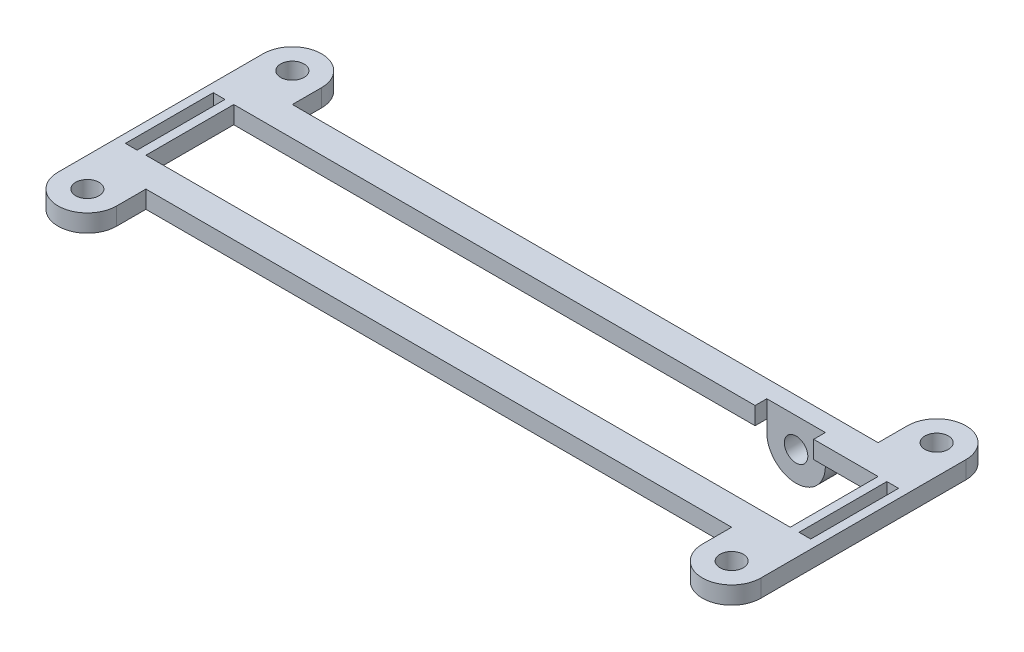
ISO-10303-21;
HEADER;
FILE_DESCRIPTION(('STEP AP214'),'2;1');
FILE_NAME('part.step','',(''),(''),'','','');
FILE_SCHEMA(('AUTOMOTIVE_DESIGN { 1 0 10303 214 1 1 1 1 }'));
ENDSEC;
DATA;
#1=APPLICATION_CONTEXT('core data for automotive mechanical design processes');
#2=APPLICATION_PROTOCOL_DEFINITION('international standard','automotive_design',2000,#1);
#3=PRODUCT_CONTEXT('',#1,'mechanical');
#4=PRODUCT('Part','Part','',(#3));
#5=PRODUCT_RELATED_PRODUCT_CATEGORY('part','',(#4));
#6=PRODUCT_DEFINITION_FORMATION('','',#4);
#7=PRODUCT_DEFINITION_CONTEXT('part definition',#1,'design');
#8=PRODUCT_DEFINITION('design','',#6,#7);
#9=PRODUCT_DEFINITION_SHAPE('','',#8);
#10=(LENGTH_UNIT() NAMED_UNIT(*) SI_UNIT(.MILLI.,.METRE.));
#11=(NAMED_UNIT(*) PLANE_ANGLE_UNIT() SI_UNIT($,.RADIAN.));
#12=(NAMED_UNIT(*) SI_UNIT($,.STERADIAN.) SOLID_ANGLE_UNIT());
#13=UNCERTAINTY_MEASURE_WITH_UNIT(LENGTH_MEASURE(1.E-05),#10,'distance_accuracy_value','');
#14=(GEOMETRIC_REPRESENTATION_CONTEXT(3) GLOBAL_UNCERTAINTY_ASSIGNED_CONTEXT((#13)) GLOBAL_UNIT_ASSIGNED_CONTEXT((#10,
#11,#12)) REPRESENTATION_CONTEXT('',''));
#15=CARTESIAN_POINT('',(0.,0.,0.));
#16=DIRECTION('',(0.,0.,1.));
#17=DIRECTION('',(1.,0.,0.));
#18=AXIS2_PLACEMENT_3D('',#15,#16,#17);
#19=CARTESIAN_POINT('',(0.,3.,-20.));
#20=DIRECTION('',(0.,0.,-1.));
#21=DIRECTION('',(-1.,0.,0.));
#22=AXIS2_PLACEMENT_3D('',#19,#20,#21);
#23=PLANE('',#22);
#24=DIRECTION('',(1.,0.,0.));
#25=VECTOR('',#24,1.);
#26=CARTESIAN_POINT('',(0.,3.,-20.));
#27=LINE('',#26,#25);
#28=CARTESIAN_POINT('',(104.,3.,-20.));
#29=VERTEX_POINT('',#28);
#30=CARTESIAN_POINT('',(115.,3.,-20.));
#31=VERTEX_POINT('',#30);
#32=EDGE_CURVE('E396',#29,#31,#27,.T.);
#33=ORIENTED_EDGE('',*,*,#32,.F.);
#34=DIRECTION('',(0.,1.,0.));
#35=VECTOR('',#34,1.);
#36=CARTESIAN_POINT('',(104.,0.,-20.));
#37=LINE('',#36,#35);
#38=CARTESIAN_POINT('',(104.,0.,-20.));
#39=VERTEX_POINT('',#38);
#40=EDGE_CURVE('E246',#39,#29,#37,.T.);
#41=ORIENTED_EDGE('',*,*,#40,.F.);
#42=DIRECTION('',(1.,0.,0.));
#43=VECTOR('',#42,1.);
#44=CARTESIAN_POINT('',(0.,0.,-20.));
#45=LINE('',#44,#43);
#46=CARTESIAN_POINT('',(115.,0.,-20.));
#47=VERTEX_POINT('',#46);
#48=EDGE_CURVE('E452',#39,#47,#45,.T.);
#49=ORIENTED_EDGE('',*,*,#48,.T.);
#50=DIRECTION('',(0.,-1.,0.));
#51=VECTOR('',#50,1.);
#52=CARTESIAN_POINT('',(115.,3.,-20.));
#53=LINE('',#52,#51);
#54=EDGE_CURVE('E11',#31,#47,#53,.T.);
#55=ORIENTED_EDGE('',*,*,#54,.F.);
#56=EDGE_LOOP('',(#33,#41,#49,#55));
#57=FACE_BOUND('',#56,.T.);
#58=ADVANCED_FACE('F34',(#57),#23,.F.);
#59=CARTESIAN_POINT('',(0.,0.,0.));
#60=DIRECTION('',(0.,1.,0.));
#61=DIRECTION('',(0.,0.,1.));
#62=AXIS2_PLACEMENT_3D('',#59,#60,#61);
#63=PLANE('',#62);
#64=CARTESIAN_POINT('',(115.,0.,5.));
#65=DIRECTION('',(0.,1.,0.));
#66=DIRECTION('',(0.,0.,1.));
#67=AXIS2_PLACEMENT_3D('',#64,#65,#66);
#68=CIRCLE('',#67,2.);
#69=CARTESIAN_POINT('',(115.,0.,6.99999999999999));
#70=VERTEX_POINT('',#69);
#71=EDGE_CURVE('E367',#70,#70,#68,.T.);
#72=ORIENTED_EDGE('',*,*,#71,.T.);
#73=EDGE_LOOP('',(#72));
#74=FACE_BOUND('',#73,.T.);
#75=CARTESIAN_POINT('',(5.,0.,5.));
#76=DIRECTION('',(0.,1.,0.));
#77=DIRECTION('',(0.,0.,1.));
#78=AXIS2_PLACEMENT_3D('',#75,#76,#77);
#79=CIRCLE('',#78,2.);
#80=CARTESIAN_POINT('',(5.,0.,7.));
#81=VERTEX_POINT('',#80);
#82=EDGE_CURVE('E468',#81,#81,#79,.T.);
#83=ORIENTED_EDGE('',*,*,#82,.T.);
#84=EDGE_LOOP('',(#83));
#85=FACE_BOUND('',#84,.T.);
#86=CARTESIAN_POINT('',(115.,0.,-30.));
#87=DIRECTION('',(0.,1.,0.));
#88=DIRECTION('',(0.,0.,1.));
#89=AXIS2_PLACEMENT_3D('',#86,#87,#88);
#90=CIRCLE('',#89,2.);
#91=CARTESIAN_POINT('',(115.,0.,-28.));
#92=VERTEX_POINT('',#91);
#93=EDGE_CURVE('E465',#92,#92,#90,.T.);
#94=ORIENTED_EDGE('',*,*,#93,.T.);
#95=EDGE_LOOP('',(#94));
#96=FACE_BOUND('',#95,.T.);
#97=CARTESIAN_POINT('',(5.,0.,-30.));
#98=DIRECTION('',(0.,1.,0.));
#99=DIRECTION('',(0.,0.,1.));
#100=AXIS2_PLACEMENT_3D('',#97,#98,#99);
#101=CIRCLE('',#100,2.);
#102=CARTESIAN_POINT('',(5.,0.,-28.));
#103=VERTEX_POINT('',#102);
#104=EDGE_CURVE('E449',#103,#103,#101,.T.);
#105=ORIENTED_EDGE('',*,*,#104,.T.);
#106=EDGE_LOOP('',(#105));
#107=FACE_BOUND('',#106,.T.);
#108=DIRECTION('',(-1.,0.,0.));
#109=VECTOR('',#108,1.);
#110=CARTESIAN_POINT('',(3.49999999999999,0.,-5.));
#111=LINE('',#110,#109);
#112=CARTESIAN_POINT('',(3.49999999999999,0.,-5.));
#113=VERTEX_POINT('',#112);
#114=CARTESIAN_POINT('',(1.49999999999999,0.,-5.));
#115=VERTEX_POINT('',#114);
#116=EDGE_CURVE('E339',#113,#115,#111,.T.);
#117=ORIENTED_EDGE('',*,*,#116,.F.);
#118=DIRECTION('',(0.,0.,1.));
#119=VECTOR('',#118,1.);
#120=CARTESIAN_POINT('',(3.49999999999999,0.,-20.));
#121=LINE('',#120,#119);
#122=CARTESIAN_POINT('',(3.49999999999999,0.,-20.));
#123=VERTEX_POINT('',#122);
#124=EDGE_CURVE('E342',#123,#113,#121,.T.);
#125=ORIENTED_EDGE('',*,*,#124,.F.);
#126=DIRECTION('',(1.,0.,0.));
#127=VECTOR('',#126,1.);
#128=CARTESIAN_POINT('',(3.49999999999999,0.,-20.));
#129=LINE('',#128,#127);
#130=CARTESIAN_POINT('',(1.49999999999999,0.,-20.));
#131=VERTEX_POINT('',#130);
#132=EDGE_CURVE('E318',#131,#123,#129,.T.);
#133=ORIENTED_EDGE('',*,*,#132,.F.);
#134=DIRECTION('',(0.,0.,-1.));
#135=VECTOR('',#134,1.);
#136=CARTESIAN_POINT('',(1.49999999999999,0.,-20.));
#137=LINE('',#136,#135);
#138=EDGE_CURVE('E336',#115,#131,#137,.T.);
#139=ORIENTED_EDGE('',*,*,#138,.F.);
#140=EDGE_LOOP('',(#117,#125,#133,#139));
#141=FACE_BOUND('',#140,.T.);
#142=DIRECTION('',(1.,0.,0.));
#143=VECTOR('',#142,1.);
#144=CARTESIAN_POINT('',(116.5,0.,-20.));
#145=LINE('',#144,#143);
#146=CARTESIAN_POINT('',(116.5,0.,-20.));
#147=VERTEX_POINT('',#146);
#148=CARTESIAN_POINT('',(118.5,0.,-20.));
#149=VERTEX_POINT('',#148);
#150=EDGE_CURVE('E310',#147,#149,#145,.T.);
#151=ORIENTED_EDGE('',*,*,#150,.F.);
#152=DIRECTION('',(0.,0.,-1.));
#153=VECTOR('',#152,1.);
#154=CARTESIAN_POINT('',(116.5,0.,-20.));
#155=LINE('',#154,#153);
#156=CARTESIAN_POINT('',(116.5,0.,-5.));
#157=VERTEX_POINT('',#156);
#158=EDGE_CURVE('E313',#157,#147,#155,.T.);
#159=ORIENTED_EDGE('',*,*,#158,.F.);
#160=DIRECTION('',(-1.,0.,0.));
#161=VECTOR('',#160,1.);
#162=CARTESIAN_POINT('',(116.5,0.,-5.));
#163=LINE('',#162,#161);
#164=CARTESIAN_POINT('',(118.5,0.,-5.));
#165=VERTEX_POINT('',#164);
#166=EDGE_CURVE('E315',#165,#157,#163,.T.);
#167=ORIENTED_EDGE('',*,*,#166,.F.);
#168=DIRECTION('',(0.,0.,1.));
#169=VECTOR('',#168,1.);
#170=CARTESIAN_POINT('',(118.5,0.,-20.));
#171=LINE('',#170,#169);
#172=EDGE_CURVE('E307',#149,#165,#171,.T.);
#173=ORIENTED_EDGE('',*,*,#172,.F.);
#174=EDGE_LOOP('',(#151,#159,#167,#173));
#175=FACE_BOUND('',#174,.T.);
#176=ORIENTED_EDGE('',*,*,#48,.F.);
#177=DIRECTION('',(0.,0.,1.));
#178=VECTOR('',#177,1.);
#179=CARTESIAN_POINT('',(104.,0.,-22.));
#180=LINE('',#179,#178);
#181=CARTESIAN_POINT('',(104.,0.,-22.));
#182=VERTEX_POINT('',#181);
#183=EDGE_CURVE('E272',#182,#39,#180,.T.);
#184=ORIENTED_EDGE('',*,*,#183,.F.);
#185=DIRECTION('',(0.,0.,-1.));
#186=VECTOR('',#185,1.);
#187=CARTESIAN_POINT('',(104.,0.,-22.));
#188=LINE('',#187,#186);
#189=CARTESIAN_POINT('',(104.,0.,-25.));
#190=VERTEX_POINT('',#189);
#191=EDGE_CURVE('E302',#182,#190,#188,.T.);
#192=ORIENTED_EDGE('',*,*,#191,.T.);
#193=DIRECTION('',(1.,0.,0.));
#194=VECTOR('',#193,1.);
#195=CARTESIAN_POINT('',(0.,0.,-25.));
#196=LINE('',#195,#194);
#197=CARTESIAN_POINT('',(110.,0.,-25.));
#198=VERTEX_POINT('',#197);
#199=EDGE_CURVE('E425',#190,#198,#196,.T.);
#200=ORIENTED_EDGE('',*,*,#199,.T.);
#201=DIRECTION('',(0.,0.,-1.));
#202=VECTOR('',#201,1.);
#203=CARTESIAN_POINT('',(110.,0.,0.));
#204=LINE('',#203,#202);
#205=CARTESIAN_POINT('',(110.,0.,-30.));
#206=VERTEX_POINT('',#205);
#207=EDGE_CURVE('E422',#198,#206,#204,.T.);
#208=ORIENTED_EDGE('',*,*,#207,.T.);
#209=CARTESIAN_POINT('',(115.,0.,-30.));
#210=DIRECTION('',(0.,1.,0.));
#211=DIRECTION('',(0.,0.,1.));
#212=AXIS2_PLACEMENT_3D('',#209,#210,#211);
#213=CIRCLE('',#212,5.);
#214=CARTESIAN_POINT('',(120.,0.,-30.));
#215=VERTEX_POINT('',#214);
#216=EDGE_CURVE('E419',#215,#206,#213,.T.);
#217=ORIENTED_EDGE('',*,*,#216,.F.);
#218=DIRECTION('',(0.,0.,-1.));
#219=VECTOR('',#218,1.);
#220=CARTESIAN_POINT('',(120.,0.,0.));
#221=LINE('',#220,#219);
#222=CARTESIAN_POINT('',(120.,0.,5.));
#223=VERTEX_POINT('',#222);
#224=EDGE_CURVE('E335',#223,#215,#221,.T.);
#225=ORIENTED_EDGE('',*,*,#224,.F.);
#226=CARTESIAN_POINT('',(115.,0.,5.));
#227=DIRECTION('',(0.,1.,0.));
#228=DIRECTION('',(0.,0.,1.));
#229=AXIS2_PLACEMENT_3D('',#226,#227,#228);
#230=CIRCLE('',#229,5.);
#231=CARTESIAN_POINT('',(110.,0.,5.));
#232=VERTEX_POINT('',#231);
#233=EDGE_CURVE('E447',#232,#223,#230,.T.);
#234=ORIENTED_EDGE('',*,*,#233,.F.);
#235=DIRECTION('',(0.,0.,1.));
#236=VECTOR('',#235,1.);
#237=CARTESIAN_POINT('',(110.,0.,0.));
#238=LINE('',#237,#236);
#239=CARTESIAN_POINT('',(110.,0.,0.));
#240=VERTEX_POINT('',#239);
#241=EDGE_CURVE('E445',#240,#232,#238,.T.);
#242=ORIENTED_EDGE('',*,*,#241,.F.);
#243=DIRECTION('',(1.,0.,0.));
#244=VECTOR('',#243,1.);
#245=CARTESIAN_POINT('',(0.,0.,0.));
#246=LINE('',#245,#244);
#247=CARTESIAN_POINT('',(10.,0.,0.));
#248=VERTEX_POINT('',#247);
#249=EDGE_CURVE('E443',#248,#240,#246,.T.);
#250=ORIENTED_EDGE('',*,*,#249,.F.);
#251=DIRECTION('',(0.,0.,1.));
#252=VECTOR('',#251,1.);
#253=CARTESIAN_POINT('',(10.,0.,0.));
#254=LINE('',#253,#252);
#255=CARTESIAN_POINT('',(10.,0.,5.));
#256=VERTEX_POINT('',#255);
#257=EDGE_CURVE('E440',#248,#256,#254,.T.);
#258=ORIENTED_EDGE('',*,*,#257,.T.);
#259=CARTESIAN_POINT('',(5.,0.,5.));
#260=DIRECTION('',(0.,1.,0.));
#261=DIRECTION('',(0.,0.,1.));
#262=AXIS2_PLACEMENT_3D('',#259,#260,#261);
#263=CIRCLE('',#262,5.);
#264=CARTESIAN_POINT('',(0.,0.,5.));
#265=VERTEX_POINT('',#264);
#266=EDGE_CURVE('E437',#265,#256,#263,.T.);
#267=ORIENTED_EDGE('',*,*,#266,.F.);
#268=DIRECTION('',(0.,0.,-1.));
#269=VECTOR('',#268,1.);
#270=CARTESIAN_POINT('',(0.,0.,0.));
#271=LINE('',#270,#269);
#272=CARTESIAN_POINT('',(0.,0.,-30.));
#273=VERTEX_POINT('',#272);
#274=EDGE_CURVE('E434',#265,#273,#271,.T.);
#275=ORIENTED_EDGE('',*,*,#274,.T.);
#276=CARTESIAN_POINT('',(5.,0.,-30.));
#277=DIRECTION('',(0.,1.,0.));
#278=DIRECTION('',(0.,0.,1.));
#279=AXIS2_PLACEMENT_3D('',#276,#277,#278);
#280=CIRCLE('',#279,5.);
#281=CARTESIAN_POINT('',(10.,0.,-30.));
#282=VERTEX_POINT('',#281);
#283=EDGE_CURVE('E431',#282,#273,#280,.T.);
#284=ORIENTED_EDGE('',*,*,#283,.F.);
#285=DIRECTION('',(0.,0.,-1.));
#286=VECTOR('',#285,1.);
#287=CARTESIAN_POINT('',(10.,0.,0.));
#288=LINE('',#287,#286);
#289=CARTESIAN_POINT('',(10.,0.,-25.));
#290=VERTEX_POINT('',#289);
#291=EDGE_CURVE('E429',#290,#282,#288,.T.);
#292=ORIENTED_EDGE('',*,*,#291,.F.);
#293=CARTESIAN_POINT('',(94.,0.,-25.));
#294=VERTEX_POINT('',#293);
#295=EDGE_CURVE('E426',#290,#294,#196,.T.);
#296=ORIENTED_EDGE('',*,*,#295,.T.);
#297=DIRECTION('',(0.,0.,-1.));
#298=VECTOR('',#297,1.);
#299=CARTESIAN_POINT('',(94.,0.,-22.));
#300=LINE('',#299,#298);
#301=CARTESIAN_POINT('',(94.,0.,-22.));
#302=VERTEX_POINT('',#301);
#303=EDGE_CURVE('E304',#302,#294,#300,.T.);
#304=ORIENTED_EDGE('',*,*,#303,.F.);
#305=DIRECTION('',(0.,0.,1.));
#306=VECTOR('',#305,1.);
#307=CARTESIAN_POINT('',(94.,0.,-22.));
#308=LINE('',#307,#306);
#309=CARTESIAN_POINT('',(94.,0.,-20.));
#310=VERTEX_POINT('',#309);
#311=EDGE_CURVE('E275',#302,#310,#308,.T.);
#312=ORIENTED_EDGE('',*,*,#311,.T.);
#313=CARTESIAN_POINT('',(5.,0.,-20.));
#314=VERTEX_POINT('',#313);
#315=EDGE_CURVE('E453',#314,#310,#45,.T.);
#316=ORIENTED_EDGE('',*,*,#315,.F.);
#317=DIRECTION('',(0.,0.,1.));
#318=VECTOR('',#317,1.);
#319=CARTESIAN_POINT('',(5.,0.,0.));
#320=LINE('',#319,#318);
#321=CARTESIAN_POINT('',(5.,0.,-5.));
#322=VERTEX_POINT('',#321);
#323=EDGE_CURVE('E462',#314,#322,#320,.T.);
#324=ORIENTED_EDGE('',*,*,#323,.T.);
#325=DIRECTION('',(1.,0.,0.));
#326=VECTOR('',#325,1.);
#327=CARTESIAN_POINT('',(0.,0.,-5.));
#328=LINE('',#327,#326);
#329=CARTESIAN_POINT('',(115.,0.,-5.));
#330=VERTEX_POINT('',#329);
#331=EDGE_CURVE('E459',#322,#330,#328,.T.);
#332=ORIENTED_EDGE('',*,*,#331,.T.);
#333=DIRECTION('',(0.,0.,1.));
#334=VECTOR('',#333,1.);
#335=CARTESIAN_POINT('',(115.,0.,0.));
#336=LINE('',#335,#334);
#337=EDGE_CURVE('E456',#47,#330,#336,.T.);
#338=ORIENTED_EDGE('',*,*,#337,.F.);
#339=EDGE_LOOP('',(#176,#184,#192,#200,#208,#217,#225,#234,#242,#250,#258,#267,#275,#284,#292,
#296,#304,#312,#316,#324,#332,#338));
#340=FACE_BOUND('',#339,.T.);
#341=ADVANCED_FACE('F516',(#74,#85,#96,#107,#141,#175,#340),#63,.F.);
#342=ORIENTED_EDGE('',*,*,#315,.T.);
#343=DIRECTION('',(0.,-1.,0.));
#344=VECTOR('',#343,1.);
#345=CARTESIAN_POINT('',(94.,0.,-20.));
#346=LINE('',#345,#344);
#347=CARTESIAN_POINT('',(94.,3.,-20.));
#348=VERTEX_POINT('',#347);
#349=EDGE_CURVE('E262',#348,#310,#346,.T.);
#350=ORIENTED_EDGE('',*,*,#349,.F.);
#351=CARTESIAN_POINT('',(5.,3.,-20.));
#352=VERTEX_POINT('',#351);
#353=EDGE_CURVE('E397',#352,#348,#27,.T.);
#354=ORIENTED_EDGE('',*,*,#353,.F.);
#355=DIRECTION('',(0.,-1.,0.));
#356=VECTOR('',#355,1.);
#357=CARTESIAN_POINT('',(5.,3.,-20.));
#358=LINE('',#357,#356);
#359=EDGE_CURVE('E473',#352,#314,#358,.T.);
#360=ORIENTED_EDGE('',*,*,#359,.T.);
#361=EDGE_LOOP('',(#342,#350,#354,#360));
#362=FACE_BOUND('',#361,.T.);
#363=ADVANCED_FACE('F580',(#362),#23,.F.);
#364=CARTESIAN_POINT('',(115.,3.,0.));
#365=DIRECTION('',(1.,0.,0.));
#366=DIRECTION('',(0.,0.,-1.));
#367=AXIS2_PLACEMENT_3D('',#364,#365,#366);
#368=PLANE('',#367);
#369=ORIENTED_EDGE('',*,*,#337,.T.);
#370=DIRECTION('',(0.,-1.,0.));
#371=VECTOR('',#370,1.);
#372=CARTESIAN_POINT('',(115.,3.,-5.));
#373=LINE('',#372,#371);
#374=CARTESIAN_POINT('',(115.,3.,-5.));
#375=VERTEX_POINT('',#374);
#376=EDGE_CURVE('E43',#375,#330,#373,.T.);
#377=ORIENTED_EDGE('',*,*,#376,.F.);
#378=DIRECTION('',(0.,0.,1.));
#379=VECTOR('',#378,1.);
#380=CARTESIAN_POINT('',(115.,3.,0.));
#381=LINE('',#380,#379);
#382=EDGE_CURVE('E399',#31,#375,#381,.T.);
#383=ORIENTED_EDGE('',*,*,#382,.F.);
#384=ORIENTED_EDGE('',*,*,#54,.T.);
#385=EDGE_LOOP('',(#369,#377,#383,#384));
#386=FACE_BOUND('',#385,.T.);
#387=ADVANCED_FACE('F588',(#386),#368,.F.);
#388=CARTESIAN_POINT('',(0.,3.,-5.));
#389=DIRECTION('',(0.,0.,-1.));
#390=DIRECTION('',(-1.,0.,0.));
#391=AXIS2_PLACEMENT_3D('',#388,#389,#390);
#392=PLANE('',#391);
#393=ORIENTED_EDGE('',*,*,#331,.F.);
#394=DIRECTION('',(0.,-1.,0.));
#395=VECTOR('',#394,1.);
#396=CARTESIAN_POINT('',(5.,3.,-5.));
#397=LINE('',#396,#395);
#398=CARTESIAN_POINT('',(5.,3.,-5.));
#399=VERTEX_POINT('',#398);
#400=EDGE_CURVE('E475',#399,#322,#397,.T.);
#401=ORIENTED_EDGE('',*,*,#400,.F.);
#402=DIRECTION('',(1.,0.,0.));
#403=VECTOR('',#402,1.);
#404=CARTESIAN_POINT('',(0.,3.,-5.));
#405=LINE('',#404,#403);
#406=EDGE_CURVE('E401',#399,#375,#405,.T.);
#407=ORIENTED_EDGE('',*,*,#406,.T.);
#408=ORIENTED_EDGE('',*,*,#376,.T.);
#409=EDGE_LOOP('',(#393,#401,#407,#408));
#410=FACE_BOUND('',#409,.T.);
#411=ADVANCED_FACE('F593',(#410),#392,.T.);
#412=CARTESIAN_POINT('',(120.,3.,0.));
#413=DIRECTION('',(-1.,0.,0.));
#414=DIRECTION('',(0.,0.,1.));
#415=AXIS2_PLACEMENT_3D('',#412,#413,#414);
#416=PLANE('',#415);
#417=ORIENTED_EDGE('',*,*,#224,.T.);
#418=DIRECTION('',(0.,-1.,0.));
#419=VECTOR('',#418,1.);
#420=CARTESIAN_POINT('',(120.,3.,-30.));
#421=LINE('',#420,#419);
#422=CARTESIAN_POINT('',(120.,3.,-30.));
#423=VERTEX_POINT('',#422);
#424=EDGE_CURVE('E38',#423,#215,#421,.T.);
#425=ORIENTED_EDGE('',*,*,#424,.F.);
#426=DIRECTION('',(0.,0.,-1.));
#427=VECTOR('',#426,1.);
#428=CARTESIAN_POINT('',(120.,3.,0.));
#429=LINE('',#428,#427);
#430=CARTESIAN_POINT('',(120.,3.,5.));
#431=VERTEX_POINT('',#430);
#432=EDGE_CURVE('E363',#431,#423,#429,.T.);
#433=ORIENTED_EDGE('',*,*,#432,.F.);
#434=DIRECTION('',(0.,-1.,0.));
#435=VECTOR('',#434,1.);
#436=CARTESIAN_POINT('',(120.,3.,5.));
#437=LINE('',#436,#435);
#438=EDGE_CURVE('E416',#431,#223,#437,.T.);
#439=ORIENTED_EDGE('',*,*,#438,.T.);
#440=EDGE_LOOP('',(#417,#425,#433,#439));
#441=FACE_BOUND('',#440,.T.);
#442=ADVANCED_FACE('F36',(#441),#416,.F.);
#443=CARTESIAN_POINT('',(115.,3.,-30.));
#444=DIRECTION('',(0.,-1.,0.));
#445=DIRECTION('',(0.,0.,-1.));
#446=AXIS2_PLACEMENT_3D('',#443,#444,#445);
#447=CYLINDRICAL_SURFACE('',#446,5.);
#448=ORIENTED_EDGE('',*,*,#216,.T.);
#449=DIRECTION('',(0.,-1.,0.));
#450=VECTOR('',#449,1.);
#451=CARTESIAN_POINT('',(110.,3.,-30.));
#452=LINE('',#451,#450);
#453=CARTESIAN_POINT('',(110.,3.,-30.));
#454=VERTEX_POINT('',#453);
#455=EDGE_CURVE('E501',#454,#206,#452,.T.);
#456=ORIENTED_EDGE('',*,*,#455,.F.);
#457=CARTESIAN_POINT('',(115.,3.,-30.));
#458=DIRECTION('',(0.,1.,0.));
#459=DIRECTION('',(0.,0.,1.));
#460=AXIS2_PLACEMENT_3D('',#457,#458,#459);
#461=CIRCLE('',#460,5.);
#462=EDGE_CURVE('E366',#423,#454,#461,.T.);
#463=ORIENTED_EDGE('',*,*,#462,.F.);
#464=ORIENTED_EDGE('',*,*,#424,.T.);
#465=EDGE_LOOP('',(#448,#456,#463,#464));
#466=FACE_BOUND('',#465,.T.);
#467=ADVANCED_FACE('F508',(#466),#447,.T.);
#468=CARTESIAN_POINT('',(110.,3.,0.));
#469=DIRECTION('',(-1.,0.,0.));
#470=DIRECTION('',(0.,0.,1.));
#471=AXIS2_PLACEMENT_3D('',#468,#469,#470);
#472=PLANE('',#471);
#473=ORIENTED_EDGE('',*,*,#207,.F.);
#474=DIRECTION('',(0.,-1.,0.));
#475=VECTOR('',#474,1.);
#476=CARTESIAN_POINT('',(110.,3.,-25.));
#477=LINE('',#476,#475);
#478=CARTESIAN_POINT('',(110.,3.,-25.));
#479=VERTEX_POINT('',#478);
#480=EDGE_CURVE('E499',#479,#198,#477,.T.);
#481=ORIENTED_EDGE('',*,*,#480,.F.);
#482=DIRECTION('',(0.,0.,-1.));
#483=VECTOR('',#482,1.);
#484=CARTESIAN_POINT('',(110.,3.,0.));
#485=LINE('',#484,#483);
#486=EDGE_CURVE('E369',#479,#454,#485,.T.);
#487=ORIENTED_EDGE('',*,*,#486,.T.);
#488=ORIENTED_EDGE('',*,*,#455,.T.);
#489=EDGE_LOOP('',(#473,#481,#487,#488));
#490=FACE_BOUND('',#489,.T.);
#491=ADVANCED_FACE('F519',(#490),#472,.T.);
#492=CARTESIAN_POINT('',(0.,3.,-25.));
#493=DIRECTION('',(0.,0.,-1.));
#494=DIRECTION('',(-1.,0.,0.));
#495=AXIS2_PLACEMENT_3D('',#492,#493,#494);
#496=PLANE('',#495);
#497=ORIENTED_EDGE('',*,*,#295,.F.);
#498=DIRECTION('',(0.,-1.,0.));
#499=VECTOR('',#498,1.);
#500=CARTESIAN_POINT('',(10.,3.,-25.));
#501=LINE('',#500,#499);
#502=CARTESIAN_POINT('',(10.,3.,-25.));
#503=VERTEX_POINT('',#502);
#504=EDGE_CURVE('E497',#503,#290,#501,.T.);
#505=ORIENTED_EDGE('',*,*,#504,.F.);
#506=DIRECTION('',(1.,0.,0.));
#507=VECTOR('',#506,1.);
#508=CARTESIAN_POINT('',(0.,3.,-25.));
#509=LINE('',#508,#507);
#510=EDGE_CURVE('E372',#503,#479,#509,.T.);
#511=ORIENTED_EDGE('',*,*,#510,.T.);
#512=ORIENTED_EDGE('',*,*,#480,.T.);
#513=ORIENTED_EDGE('',*,*,#199,.F.);
#514=DIRECTION('',(0.,1.,0.));
#515=VECTOR('',#514,1.);
#516=CARTESIAN_POINT('',(104.,7.18054692543634E-13,-25.));
#517=LINE('',#516,#515);
#518=CARTESIAN_POINT('',(104.,-2.01,-25.));
#519=VERTEX_POINT('',#518);
#520=EDGE_CURVE('E51',#519,#190,#517,.T.);
#521=ORIENTED_EDGE('',*,*,#520,.F.);
#522=CARTESIAN_POINT('',(99.,-2.01,-25.));
#523=DIRECTION('',(0.,0.,-1.));
#524=DIRECTION('',(-1.,0.,0.));
#525=AXIS2_PLACEMENT_3D('',#522,#523,#524);
#526=CIRCLE('',#525,5.);
#527=CARTESIAN_POINT('',(94.,-2.01,-25.));
#528=VERTEX_POINT('',#527);
#529=EDGE_CURVE('E292',#519,#528,#526,.T.);
#530=ORIENTED_EDGE('',*,*,#529,.T.);
#531=DIRECTION('',(0.,1.,0.));
#532=VECTOR('',#531,1.);
#533=CARTESIAN_POINT('',(94.,6.49010972106746E-13,-25.));
#534=LINE('',#533,#532);
#535=EDGE_CURVE('E295',#528,#294,#534,.T.);
#536=ORIENTED_EDGE('',*,*,#535,.T.);
#537=EDGE_LOOP('',(#497,#505,#511,#512,#513,#521,#530,#536));
#538=FACE_BOUND('',#537,.T.);
#539=CARTESIAN_POINT('',(99.,-2.01,-25.));
#540=DIRECTION('',(0.,0.,-1.));
#541=DIRECTION('',(-1.,0.,0.));
#542=AXIS2_PLACEMENT_3D('',#539,#540,#541);
#543=CIRCLE('',#542,2.);
#544=CARTESIAN_POINT('',(97.,-2.01,-25.));
#545=VERTEX_POINT('',#544);
#546=EDGE_CURVE('E274',#545,#545,#543,.T.);
#547=ORIENTED_EDGE('',*,*,#546,.F.);
#548=EDGE_LOOP('',(#547));
#549=FACE_BOUND('',#548,.T.);
#550=ADVANCED_FACE('F526',(#538,#549),#496,.T.);
#551=CARTESIAN_POINT('',(10.,3.,0.));
#552=DIRECTION('',(-1.,0.,0.));
#553=DIRECTION('',(0.,0.,1.));
#554=AXIS2_PLACEMENT_3D('',#551,#552,#553);
#555=PLANE('',#554);
#556=ORIENTED_EDGE('',*,*,#291,.T.);
#557=DIRECTION('',(0.,-1.,0.));
#558=VECTOR('',#557,1.);
#559=CARTESIAN_POINT('',(10.,3.,-30.));
#560=LINE('',#559,#558);
#561=CARTESIAN_POINT('',(10.,3.,-30.));
#562=VERTEX_POINT('',#561);
#563=EDGE_CURVE('E494',#562,#282,#560,.T.);
#564=ORIENTED_EDGE('',*,*,#563,.F.);
#565=DIRECTION('',(0.,0.,-1.));
#566=VECTOR('',#565,1.);
#567=CARTESIAN_POINT('',(10.,3.,0.));
#568=LINE('',#567,#566);
#569=EDGE_CURVE('E375',#503,#562,#568,.T.);
#570=ORIENTED_EDGE('',*,*,#569,.F.);
#571=ORIENTED_EDGE('',*,*,#504,.T.);
#572=EDGE_LOOP('',(#556,#564,#570,#571));
#573=FACE_BOUND('',#572,.T.);
#574=ADVANCED_FACE('F532',(#573),#555,.F.);
#575=CARTESIAN_POINT('',(5.,3.,-30.));
#576=DIRECTION('',(0.,-1.,0.));
#577=DIRECTION('',(0.,0.,-1.));
#578=AXIS2_PLACEMENT_3D('',#575,#576,#577);
#579=CYLINDRICAL_SURFACE('',#578,5.);
#580=ORIENTED_EDGE('',*,*,#283,.T.);
#581=DIRECTION('',(0.,-1.,0.));
#582=VECTOR('',#581,1.);
#583=CARTESIAN_POINT('',(0.,3.,-30.));
#584=LINE('',#583,#582);
#585=CARTESIAN_POINT('',(0.,3.,-30.));
#586=VERTEX_POINT('',#585);
#587=EDGE_CURVE('E492',#586,#273,#584,.T.);
#588=ORIENTED_EDGE('',*,*,#587,.F.);
#589=CARTESIAN_POINT('',(5.,3.,-30.));
#590=DIRECTION('',(0.,1.,0.));
#591=DIRECTION('',(0.,0.,1.));
#592=AXIS2_PLACEMENT_3D('',#589,#590,#591);
#593=CIRCLE('',#592,5.);
#594=EDGE_CURVE('E377',#562,#586,#593,.T.);
#595=ORIENTED_EDGE('',*,*,#594,.F.);
#596=ORIENTED_EDGE('',*,*,#563,.T.);
#597=EDGE_LOOP('',(#580,#588,#595,#596));
#598=FACE_BOUND('',#597,.T.);
#599=ADVANCED_FACE('F537',(#598),#579,.T.);
#600=CARTESIAN_POINT('',(0.,3.,0.));
#601=DIRECTION('',(-1.,0.,0.));
#602=DIRECTION('',(0.,0.,1.));
#603=AXIS2_PLACEMENT_3D('',#600,#601,#602);
#604=PLANE('',#603);
#605=ORIENTED_EDGE('',*,*,#274,.F.);
#606=DIRECTION('',(0.,-1.,0.));
#607=VECTOR('',#606,1.);
#608=CARTESIAN_POINT('',(0.,3.,5.));
#609=LINE('',#608,#607);
#610=CARTESIAN_POINT('',(0.,3.,5.));
#611=VERTEX_POINT('',#610);
#612=EDGE_CURVE('E490',#611,#265,#609,.T.);
#613=ORIENTED_EDGE('',*,*,#612,.F.);
#614=DIRECTION('',(0.,0.,-1.));
#615=VECTOR('',#614,1.);
#616=CARTESIAN_POINT('',(0.,3.,0.));
#617=LINE('',#616,#615);
#618=EDGE_CURVE('E379',#611,#586,#617,.T.);
#619=ORIENTED_EDGE('',*,*,#618,.T.);
#620=ORIENTED_EDGE('',*,*,#587,.T.);
#621=EDGE_LOOP('',(#605,#613,#619,#620));
#622=FACE_BOUND('',#621,.T.);
#623=ADVANCED_FACE('F541',(#622),#604,.T.);
#624=CARTESIAN_POINT('',(5.,3.,5.));
#625=DIRECTION('',(0.,-1.,0.));
#626=DIRECTION('',(0.,0.,-1.));
#627=AXIS2_PLACEMENT_3D('',#624,#625,#626);
#628=CYLINDRICAL_SURFACE('',#627,5.);
#629=ORIENTED_EDGE('',*,*,#266,.T.);
#630=DIRECTION('',(0.,-1.,0.));
#631=VECTOR('',#630,1.);
#632=CARTESIAN_POINT('',(10.,3.,5.));
#633=LINE('',#632,#631);
#634=CARTESIAN_POINT('',(10.,3.,5.));
#635=VERTEX_POINT('',#634);
#636=EDGE_CURVE('E488',#635,#256,#633,.T.);
#637=ORIENTED_EDGE('',*,*,#636,.F.);
#638=CARTESIAN_POINT('',(5.,3.,5.));
#639=DIRECTION('',(0.,1.,0.));
#640=DIRECTION('',(0.,0.,1.));
#641=AXIS2_PLACEMENT_3D('',#638,#639,#640);
#642=CIRCLE('',#641,5.);
#643=EDGE_CURVE('E382',#611,#635,#642,.T.);
#644=ORIENTED_EDGE('',*,*,#643,.F.);
#645=ORIENTED_EDGE('',*,*,#612,.T.);
#646=EDGE_LOOP('',(#629,#637,#644,#645));
#647=FACE_BOUND('',#646,.T.);
#648=ADVANCED_FACE('F546',(#647),#628,.T.);
#649=CARTESIAN_POINT('',(10.,3.,0.));
#650=DIRECTION('',(1.,0.,0.));
#651=DIRECTION('',(0.,0.,-1.));
#652=AXIS2_PLACEMENT_3D('',#649,#650,#651);
#653=PLANE('',#652);
#654=ORIENTED_EDGE('',*,*,#257,.F.);
#655=DIRECTION('',(0.,-1.,0.));
#656=VECTOR('',#655,1.);
#657=CARTESIAN_POINT('',(10.,3.,0.));
#658=LINE('',#657,#656);
#659=CARTESIAN_POINT('',(10.,3.,0.));
#660=VERTEX_POINT('',#659);
#661=EDGE_CURVE('E486',#660,#248,#658,.T.);
#662=ORIENTED_EDGE('',*,*,#661,.F.);
#663=DIRECTION('',(0.,0.,1.));
#664=VECTOR('',#663,1.);
#665=CARTESIAN_POINT('',(10.,3.,0.));
#666=LINE('',#665,#664);
#667=EDGE_CURVE('E384',#660,#635,#666,.T.);
#668=ORIENTED_EDGE('',*,*,#667,.T.);
#669=ORIENTED_EDGE('',*,*,#636,.T.);
#670=EDGE_LOOP('',(#654,#662,#668,#669));
#671=FACE_BOUND('',#670,.T.);
#672=ADVANCED_FACE('F552',(#671),#653,.T.);
#673=CARTESIAN_POINT('',(0.,3.,0.));
#674=DIRECTION('',(0.,0.,-1.));
#675=DIRECTION('',(-1.,0.,0.));
#676=AXIS2_PLACEMENT_3D('',#673,#674,#675);
#677=PLANE('',#676);
#678=ORIENTED_EDGE('',*,*,#249,.T.);
#679=DIRECTION('',(0.,-1.,0.));
#680=VECTOR('',#679,1.);
#681=CARTESIAN_POINT('',(110.,3.,0.));
#682=LINE('',#681,#680);
#683=CARTESIAN_POINT('',(110.,3.,0.));
#684=VERTEX_POINT('',#683);
#685=EDGE_CURVE('E483',#684,#240,#682,.T.);
#686=ORIENTED_EDGE('',*,*,#685,.F.);
#687=DIRECTION('',(1.,0.,0.));
#688=VECTOR('',#687,1.);
#689=CARTESIAN_POINT('',(0.,3.,0.));
#690=LINE('',#689,#688);
#691=EDGE_CURVE('E387',#660,#684,#690,.T.);
#692=ORIENTED_EDGE('',*,*,#691,.F.);
#693=ORIENTED_EDGE('',*,*,#661,.T.);
#694=EDGE_LOOP('',(#678,#686,#692,#693));
#695=FACE_BOUND('',#694,.T.);
#696=ADVANCED_FACE('F555',(#695),#677,.F.);
#697=CARTESIAN_POINT('',(110.,3.,0.));
#698=DIRECTION('',(1.,0.,0.));
#699=DIRECTION('',(0.,0.,-1.));
#700=AXIS2_PLACEMENT_3D('',#697,#698,#699);
#701=PLANE('',#700);
#702=ORIENTED_EDGE('',*,*,#241,.T.);
#703=DIRECTION('',(0.,-1.,0.));
#704=VECTOR('',#703,1.);
#705=CARTESIAN_POINT('',(110.,3.,5.));
#706=LINE('',#705,#704);
#707=CARTESIAN_POINT('',(110.,3.,5.));
#708=VERTEX_POINT('',#707);
#709=EDGE_CURVE('E480',#708,#232,#706,.T.);
#710=ORIENTED_EDGE('',*,*,#709,.F.);
#711=DIRECTION('',(0.,0.,1.));
#712=VECTOR('',#711,1.);
#713=CARTESIAN_POINT('',(110.,3.,0.));
#714=LINE('',#713,#712);
#715=EDGE_CURVE('E389',#684,#708,#714,.T.);
#716=ORIENTED_EDGE('',*,*,#715,.F.);
#717=ORIENTED_EDGE('',*,*,#685,.T.);
#718=EDGE_LOOP('',(#702,#710,#716,#717));
#719=FACE_BOUND('',#718,.T.);
#720=ADVANCED_FACE('F559',(#719),#701,.F.);
#721=CARTESIAN_POINT('',(5.,3.,5.));
#722=DIRECTION('',(0.,-1.,0.));
#723=DIRECTION('',(0.,0.,-1.));
#724=AXIS2_PLACEMENT_3D('',#721,#722,#723);
#725=CYLINDRICAL_SURFACE('',#724,2.);
#726=CARTESIAN_POINT('',(5.,3.,5.));
#727=DIRECTION('',(0.,1.,0.));
#728=DIRECTION('',(0.,0.,1.));
#729=AXIS2_PLACEMENT_3D('',#726,#727,#728);
#730=CIRCLE('',#729,2.);
#731=CARTESIAN_POINT('',(5.,3.,7.));
#732=VERTEX_POINT('',#731);
#733=EDGE_CURVE('E410',#732,#732,#730,.T.);
#734=ORIENTED_EDGE('',*,*,#733,.T.);
#735=EDGE_LOOP('',(#734));
#736=FACE_BOUND('',#735,.T.);
#737=ORIENTED_EDGE('',*,*,#82,.F.);
#738=EDGE_LOOP('',(#737));
#739=FACE_BOUND('',#738,.T.);
#740=ADVANCED_FACE('F673',(#736,#739),#725,.F.);
#741=CARTESIAN_POINT('',(115.,3.,-30.));
#742=DIRECTION('',(0.,-1.,0.));
#743=DIRECTION('',(0.,0.,-1.));
#744=AXIS2_PLACEMENT_3D('',#741,#742,#743);
#745=CYLINDRICAL_SURFACE('',#744,2.);
#746=CARTESIAN_POINT('',(115.,3.,-30.));
#747=DIRECTION('',(0.,1.,0.));
#748=DIRECTION('',(0.,0.,1.));
#749=AXIS2_PLACEMENT_3D('',#746,#747,#748);
#750=CIRCLE('',#749,2.);
#751=CARTESIAN_POINT('',(115.,3.,-28.));
#752=VERTEX_POINT('',#751);
#753=EDGE_CURVE('E407',#752,#752,#750,.T.);
#754=ORIENTED_EDGE('',*,*,#753,.T.);
#755=EDGE_LOOP('',(#754));
#756=FACE_BOUND('',#755,.T.);
#757=ORIENTED_EDGE('',*,*,#93,.F.);
#758=EDGE_LOOP('',(#757));
#759=FACE_BOUND('',#758,.T.);
#760=ADVANCED_FACE('F676',(#756,#759),#745,.F.);
#761=CARTESIAN_POINT('',(5.,3.,0.));
#762=DIRECTION('',(1.,0.,0.));
#763=DIRECTION('',(0.,0.,-1.));
#764=AXIS2_PLACEMENT_3D('',#761,#762,#763);
#765=PLANE('',#764);
#766=ORIENTED_EDGE('',*,*,#323,.F.);
#767=ORIENTED_EDGE('',*,*,#359,.F.);
#768=DIRECTION('',(0.,0.,1.));
#769=VECTOR('',#768,1.);
#770=CARTESIAN_POINT('',(5.,3.,0.));
#771=LINE('',#770,#769);
#772=EDGE_CURVE('E404',#352,#399,#771,.T.);
#773=ORIENTED_EDGE('',*,*,#772,.T.);
#774=ORIENTED_EDGE('',*,*,#400,.T.);
#775=EDGE_LOOP('',(#766,#767,#773,#774));
#776=FACE_BOUND('',#775,.T.);
#777=ADVANCED_FACE('F573',(#776),#765,.T.);
#778=CARTESIAN_POINT('',(5.,3.,-30.));
#779=DIRECTION('',(0.,-1.,0.));
#780=DIRECTION('',(0.,0.,-1.));
#781=AXIS2_PLACEMENT_3D('',#778,#779,#780);
#782=CYLINDRICAL_SURFACE('',#781,2.);
#783=CARTESIAN_POINT('',(5.,3.,-30.));
#784=DIRECTION('',(0.,1.,0.));
#785=DIRECTION('',(0.,0.,1.));
#786=AXIS2_PLACEMENT_3D('',#783,#784,#785);
#787=CIRCLE('',#786,2.);
#788=CARTESIAN_POINT('',(5.,3.,-28.));
#789=VERTEX_POINT('',#788);
#790=EDGE_CURVE('E393',#789,#789,#787,.T.);
#791=ORIENTED_EDGE('',*,*,#790,.T.);
#792=EDGE_LOOP('',(#791));
#793=FACE_BOUND('',#792,.T.);
#794=ORIENTED_EDGE('',*,*,#104,.F.);
#795=EDGE_LOOP('',(#794));
#796=FACE_BOUND('',#795,.T.);
#797=ADVANCED_FACE('F565',(#793,#796),#782,.F.);
#798=CARTESIAN_POINT('',(115.,3.,5.));
#799=DIRECTION('',(0.,-1.,0.));
#800=DIRECTION('',(0.,0.,-1.));
#801=AXIS2_PLACEMENT_3D('',#798,#799,#800);
#802=CYLINDRICAL_SURFACE('',#801,5.);
#803=ORIENTED_EDGE('',*,*,#233,.T.);
#804=ORIENTED_EDGE('',*,*,#438,.F.);
#805=CARTESIAN_POINT('',(115.,3.,5.));
#806=DIRECTION('',(0.,1.,0.));
#807=DIRECTION('',(0.,0.,1.));
#808=AXIS2_PLACEMENT_3D('',#805,#806,#807);
#809=CIRCLE('',#808,5.);
#810=EDGE_CURVE('E391',#708,#431,#809,.T.);
#811=ORIENTED_EDGE('',*,*,#810,.F.);
#812=ORIENTED_EDGE('',*,*,#709,.T.);
#813=EDGE_LOOP('',(#803,#804,#811,#812));
#814=FACE_BOUND('',#813,.T.);
#815=ADVANCED_FACE('F562',(#814),#802,.T.);
#816=CARTESIAN_POINT('',(115.,3.,5.));
#817=DIRECTION('',(0.,-1.,0.));
#818=DIRECTION('',(0.,0.,-1.));
#819=AXIS2_PLACEMENT_3D('',#816,#817,#818);
#820=CYLINDRICAL_SURFACE('',#819,2.);
#821=CARTESIAN_POINT('',(115.,3.,5.));
#822=DIRECTION('',(0.,1.,0.));
#823=DIRECTION('',(0.,0.,1.));
#824=AXIS2_PLACEMENT_3D('',#821,#822,#823);
#825=CIRCLE('',#824,2.);
#826=CARTESIAN_POINT('',(115.,3.,6.99999999999999));
#827=VERTEX_POINT('',#826);
#828=EDGE_CURVE('E413',#827,#827,#825,.T.);
#829=ORIENTED_EDGE('',*,*,#828,.T.);
#830=EDGE_LOOP('',(#829));
#831=FACE_BOUND('',#830,.T.);
#832=ORIENTED_EDGE('',*,*,#71,.F.);
#833=EDGE_LOOP('',(#832));
#834=FACE_BOUND('',#833,.T.);
#835=ADVANCED_FACE('F564',(#831,#834),#820,.F.);
#836=CARTESIAN_POINT('',(0.,3.,0.));
#837=DIRECTION('',(0.,1.,0.));
#838=DIRECTION('',(0.,0.,1.));
#839=AXIS2_PLACEMENT_3D('',#836,#837,#838);
#840=PLANE('',#839);
#841=DIRECTION('',(0.,0.,1.));
#842=VECTOR('',#841,1.);
#843=CARTESIAN_POINT('',(104.,3.,-22.));
#844=LINE('',#843,#842);
#845=CARTESIAN_POINT('',(104.,3.,-22.));
#846=VERTEX_POINT('',#845);
#847=EDGE_CURVE('E240',#846,#29,#844,.T.);
#848=ORIENTED_EDGE('',*,*,#847,.T.);
#849=ORIENTED_EDGE('',*,*,#32,.T.);
#850=ORIENTED_EDGE('',*,*,#382,.T.);
#851=ORIENTED_EDGE('',*,*,#406,.F.);
#852=ORIENTED_EDGE('',*,*,#772,.F.);
#853=ORIENTED_EDGE('',*,*,#353,.T.);
#854=DIRECTION('',(0.,0.,1.));
#855=VECTOR('',#854,1.);
#856=CARTESIAN_POINT('',(94.,3.,-22.));
#857=LINE('',#856,#855);
#858=CARTESIAN_POINT('',(94.,3.,-22.));
#859=VERTEX_POINT('',#858);
#860=EDGE_CURVE('E250',#859,#348,#857,.T.);
#861=ORIENTED_EDGE('',*,*,#860,.F.);
#862=DIRECTION('',(-1.,0.,0.));
#863=VECTOR('',#862,1.);
#864=CARTESIAN_POINT('',(104.,3.,-22.));
#865=LINE('',#864,#863);
#866=EDGE_CURVE('E258',#846,#859,#865,.T.);
#867=ORIENTED_EDGE('',*,*,#866,.F.);
#868=EDGE_LOOP('',(#848,#849,#850,#851,#852,#853,#861,#867));
#869=FACE_BOUND('',#868,.T.);
#870=DIRECTION('',(0.,0.,1.));
#871=VECTOR('',#870,1.);
#872=CARTESIAN_POINT('',(116.5,3.,-20.));
#873=LINE('',#872,#871);
#874=CARTESIAN_POINT('',(116.5,3.,-20.));
#875=VERTEX_POINT('',#874);
#876=CARTESIAN_POINT('',(116.5,3.,-5.));
#877=VERTEX_POINT('',#876);
#878=EDGE_CURVE('E59',#875,#877,#873,.T.);
#879=ORIENTED_EDGE('',*,*,#878,.F.);
#880=DIRECTION('',(-1.,0.,0.));
#881=VECTOR('',#880,1.);
#882=CARTESIAN_POINT('',(116.5,3.,-20.));
#883=LINE('',#882,#881);
#884=CARTESIAN_POINT('',(118.5,3.,-20.));
#885=VERTEX_POINT('',#884);
#886=EDGE_CURVE('E324',#885,#875,#883,.T.);
#887=ORIENTED_EDGE('',*,*,#886,.F.);
#888=DIRECTION('',(0.,0.,-1.));
#889=VECTOR('',#888,1.);
#890=CARTESIAN_POINT('',(118.5,3.,-20.));
#891=LINE('',#890,#889);
#892=CARTESIAN_POINT('',(118.5,3.,-5.));
#893=VERTEX_POINT('',#892);
#894=EDGE_CURVE('E321',#893,#885,#891,.T.);
#895=ORIENTED_EDGE('',*,*,#894,.F.);
#896=DIRECTION('',(1.,0.,0.));
#897=VECTOR('',#896,1.);
#898=CARTESIAN_POINT('',(116.5,3.,-5.));
#899=LINE('',#898,#897);
#900=EDGE_CURVE('E317',#877,#893,#899,.T.);
#901=ORIENTED_EDGE('',*,*,#900,.F.);
#902=EDGE_LOOP('',(#879,#887,#895,#901));
#903=FACE_BOUND('',#902,.T.);
#904=DIRECTION('',(0.,0.,-1.));
#905=VECTOR('',#904,1.);
#906=CARTESIAN_POINT('',(3.49999999999999,3.,-20.));
#907=LINE('',#906,#905);
#908=CARTESIAN_POINT('',(3.49999999999999,3.,-5.));
#909=VERTEX_POINT('',#908);
#910=CARTESIAN_POINT('',(3.49999999999999,3.,-20.));
#911=VERTEX_POINT('',#910);
#912=EDGE_CURVE('E301',#909,#911,#907,.T.);
#913=ORIENTED_EDGE('',*,*,#912,.F.);
#914=DIRECTION('',(1.,0.,0.));
#915=VECTOR('',#914,1.);
#916=CARTESIAN_POINT('',(3.49999999999999,3.,-5.));
#917=LINE('',#916,#915);
#918=CARTESIAN_POINT('',(1.49999999999999,3.,-5.));
#919=VERTEX_POINT('',#918);
#920=EDGE_CURVE('E351',#919,#909,#917,.T.);
#921=ORIENTED_EDGE('',*,*,#920,.F.);
#922=DIRECTION('',(0.,0.,1.));
#923=VECTOR('',#922,1.);
#924=CARTESIAN_POINT('',(1.49999999999999,3.,-20.));
#925=LINE('',#924,#923);
#926=CARTESIAN_POINT('',(1.49999999999999,3.,-20.));
#927=VERTEX_POINT('',#926);
#928=EDGE_CURVE('E348',#927,#919,#925,.T.);
#929=ORIENTED_EDGE('',*,*,#928,.F.);
#930=DIRECTION('',(-1.,0.,0.));
#931=VECTOR('',#930,1.);
#932=CARTESIAN_POINT('',(3.49999999999999,3.,-20.));
#933=LINE('',#932,#931);
#934=EDGE_CURVE('E345',#911,#927,#933,.T.);
#935=ORIENTED_EDGE('',*,*,#934,.F.);
#936=EDGE_LOOP('',(#913,#921,#929,#935));
#937=FACE_BOUND('',#936,.T.);
#938=ORIENTED_EDGE('',*,*,#432,.T.);
#939=ORIENTED_EDGE('',*,*,#462,.T.);
#940=ORIENTED_EDGE('',*,*,#486,.F.);
#941=ORIENTED_EDGE('',*,*,#510,.F.);
#942=ORIENTED_EDGE('',*,*,#569,.T.);
#943=ORIENTED_EDGE('',*,*,#594,.T.);
#944=ORIENTED_EDGE('',*,*,#618,.F.);
#945=ORIENTED_EDGE('',*,*,#643,.T.);
#946=ORIENTED_EDGE('',*,*,#667,.F.);
#947=ORIENTED_EDGE('',*,*,#691,.T.);
#948=ORIENTED_EDGE('',*,*,#715,.T.);
#949=ORIENTED_EDGE('',*,*,#810,.T.);
#950=EDGE_LOOP('',(#938,#939,#940,#941,#942,#943,#944,#945,#946,#947,#948,#949));
#951=FACE_BOUND('',#950,.T.);
#952=ORIENTED_EDGE('',*,*,#790,.F.);
#953=EDGE_LOOP('',(#952));
#954=FACE_BOUND('',#953,.T.);
#955=ORIENTED_EDGE('',*,*,#753,.F.);
#956=EDGE_LOOP('',(#955));
#957=FACE_BOUND('',#956,.T.);
#958=ORIENTED_EDGE('',*,*,#733,.F.);
#959=EDGE_LOOP('',(#958));
#960=FACE_BOUND('',#959,.T.);
#961=ORIENTED_EDGE('',*,*,#828,.F.);
#962=EDGE_LOOP('',(#961));
#963=FACE_BOUND('',#962,.T.);
#964=ADVANCED_FACE('F264',(#869,#903,#937,#951,#954,#957,#960,#963),#840,.T.);
#965=CARTESIAN_POINT('',(3.49999999999999,-15.1327459504216,-20.));
#966=DIRECTION('',(1.,0.,0.));
#967=DIRECTION('',(0.,0.,-1.));
#968=AXIS2_PLACEMENT_3D('',#965,#966,#967);
#969=PLANE('',#968);
#970=ORIENTED_EDGE('',*,*,#124,.T.);
#971=DIRECTION('',(0.,1.,0.));
#972=VECTOR('',#971,1.);
#973=CARTESIAN_POINT('',(3.49999999999999,-15.1327459504216,-5.));
#974=LINE('',#973,#972);
#975=EDGE_CURVE('E340',#113,#909,#974,.T.);
#976=ORIENTED_EDGE('',*,*,#975,.T.);
#977=ORIENTED_EDGE('',*,*,#912,.T.);
#978=DIRECTION('',(0.,1.,0.));
#979=VECTOR('',#978,1.);
#980=CARTESIAN_POINT('',(3.49999999999999,-15.1327459504216,-20.));
#981=LINE('',#980,#979);
#982=EDGE_CURVE('E354',#123,#911,#981,.T.);
#983=ORIENTED_EDGE('',*,*,#982,.F.);
#984=EDGE_LOOP('',(#970,#976,#977,#983));
#985=FACE_BOUND('',#984,.T.);
#986=ADVANCED_FACE('F660',(#985),#969,.F.);
#987=CARTESIAN_POINT('',(3.49999999999999,-15.1327459504216,-5.));
#988=DIRECTION('',(0.,0.,1.));
#989=DIRECTION('',(1.,0.,0.));
#990=AXIS2_PLACEMENT_3D('',#987,#988,#989);
#991=PLANE('',#990);
#992=ORIENTED_EDGE('',*,*,#116,.T.);
#993=DIRECTION('',(0.,1.,0.));
#994=VECTOR('',#993,1.);
#995=CARTESIAN_POINT('',(1.49999999999999,-15.1327459504216,-5.));
#996=LINE('',#995,#994);
#997=EDGE_CURVE('E356',#115,#919,#996,.T.);
#998=ORIENTED_EDGE('',*,*,#997,.T.);
#999=ORIENTED_EDGE('',*,*,#920,.T.);
#1000=ORIENTED_EDGE('',*,*,#975,.F.);
#1001=EDGE_LOOP('',(#992,#998,#999,#1000));
#1002=FACE_BOUND('',#1001,.T.);
#1003=ADVANCED_FACE('F656',(#1002),#991,.F.);
#1004=CARTESIAN_POINT('',(1.49999999999999,-15.1327459504216,-20.));
#1005=DIRECTION('',(-1.,0.,0.));
#1006=DIRECTION('',(0.,0.,1.));
#1007=AXIS2_PLACEMENT_3D('',#1004,#1005,#1006);
#1008=PLANE('',#1007);
#1009=ORIENTED_EDGE('',*,*,#138,.T.);
#1010=DIRECTION('',(0.,1.,0.));
#1011=VECTOR('',#1010,1.);
#1012=CARTESIAN_POINT('',(1.49999999999999,-15.1327459504216,-20.));
#1013=LINE('',#1012,#1011);
#1014=EDGE_CURVE('E358',#131,#927,#1013,.T.);
#1015=ORIENTED_EDGE('',*,*,#1014,.T.);
#1016=ORIENTED_EDGE('',*,*,#928,.T.);
#1017=ORIENTED_EDGE('',*,*,#997,.F.);
#1018=EDGE_LOOP('',(#1009,#1015,#1016,#1017));
#1019=FACE_BOUND('',#1018,.T.);
#1020=ADVANCED_FACE('F659',(#1019),#1008,.F.);
#1021=CARTESIAN_POINT('',(3.49999999999999,-15.1327459504216,-20.));
#1022=DIRECTION('',(0.,0.,-1.));
#1023=DIRECTION('',(-1.,0.,0.));
#1024=AXIS2_PLACEMENT_3D('',#1021,#1022,#1023);
#1025=PLANE('',#1024);
#1026=ORIENTED_EDGE('',*,*,#132,.T.);
#1027=ORIENTED_EDGE('',*,*,#982,.T.);
#1028=ORIENTED_EDGE('',*,*,#934,.T.);
#1029=ORIENTED_EDGE('',*,*,#1014,.F.);
#1030=EDGE_LOOP('',(#1026,#1027,#1028,#1029));
#1031=FACE_BOUND('',#1030,.T.);
#1032=ADVANCED_FACE('F655',(#1031),#1025,.F.);
#1033=CARTESIAN_POINT('',(116.5,-15.1327459504216,-20.));
#1034=DIRECTION('',(-1.,0.,0.));
#1035=DIRECTION('',(0.,0.,1.));
#1036=AXIS2_PLACEMENT_3D('',#1033,#1034,#1035);
#1037=PLANE('',#1036);
#1038=ORIENTED_EDGE('',*,*,#158,.T.);
#1039=DIRECTION('',(0.,1.,0.));
#1040=VECTOR('',#1039,1.);
#1041=CARTESIAN_POINT('',(116.5,-15.1327459504216,-20.));
#1042=LINE('',#1041,#1040);
#1043=EDGE_CURVE('E311',#147,#875,#1042,.T.);
#1044=ORIENTED_EDGE('',*,*,#1043,.T.);
#1045=ORIENTED_EDGE('',*,*,#878,.T.);
#1046=DIRECTION('',(0.,1.,0.));
#1047=VECTOR('',#1046,1.);
#1048=CARTESIAN_POINT('',(116.5,-15.1327459504216,-5.));
#1049=LINE('',#1048,#1047);
#1050=EDGE_CURVE('E327',#157,#877,#1049,.T.);
#1051=ORIENTED_EDGE('',*,*,#1050,.F.);
#1052=EDGE_LOOP('',(#1038,#1044,#1045,#1051));
#1053=FACE_BOUND('',#1052,.T.);
#1054=ADVANCED_FACE('F645',(#1053),#1037,.F.);
#1055=CARTESIAN_POINT('',(116.5,-15.1327459504216,-20.));
#1056=DIRECTION('',(0.,0.,-1.));
#1057=DIRECTION('',(-1.,0.,0.));
#1058=AXIS2_PLACEMENT_3D('',#1055,#1056,#1057);
#1059=PLANE('',#1058);
#1060=ORIENTED_EDGE('',*,*,#150,.T.);
#1061=DIRECTION('',(0.,1.,0.));
#1062=VECTOR('',#1061,1.);
#1063=CARTESIAN_POINT('',(118.5,-15.1327459504216,-20.));
#1064=LINE('',#1063,#1062);
#1065=EDGE_CURVE('E329',#149,#885,#1064,.T.);
#1066=ORIENTED_EDGE('',*,*,#1065,.T.);
#1067=ORIENTED_EDGE('',*,*,#886,.T.);
#1068=ORIENTED_EDGE('',*,*,#1043,.F.);
#1069=EDGE_LOOP('',(#1060,#1066,#1067,#1068));
#1070=FACE_BOUND('',#1069,.T.);
#1071=ADVANCED_FACE('F641',(#1070),#1059,.F.);
#1072=CARTESIAN_POINT('',(118.5,-15.1327459504216,-20.));
#1073=DIRECTION('',(1.,0.,0.));
#1074=DIRECTION('',(0.,0.,-1.));
#1075=AXIS2_PLACEMENT_3D('',#1072,#1073,#1074);
#1076=PLANE('',#1075);
#1077=ORIENTED_EDGE('',*,*,#172,.T.);
#1078=DIRECTION('',(0.,1.,0.));
#1079=VECTOR('',#1078,1.);
#1080=CARTESIAN_POINT('',(118.5,-15.1327459504216,-5.));
#1081=LINE('',#1080,#1079);
#1082=EDGE_CURVE('E331',#165,#893,#1081,.T.);
#1083=ORIENTED_EDGE('',*,*,#1082,.T.);
#1084=ORIENTED_EDGE('',*,*,#894,.T.);
#1085=ORIENTED_EDGE('',*,*,#1065,.F.);
#1086=EDGE_LOOP('',(#1077,#1083,#1084,#1085));
#1087=FACE_BOUND('',#1086,.T.);
#1088=ADVANCED_FACE('F644',(#1087),#1076,.F.);
#1089=CARTESIAN_POINT('',(116.5,-15.1327459504216,-5.));
#1090=DIRECTION('',(0.,0.,1.));
#1091=DIRECTION('',(1.,0.,0.));
#1092=AXIS2_PLACEMENT_3D('',#1089,#1090,#1091);
#1093=PLANE('',#1092);
#1094=ORIENTED_EDGE('',*,*,#166,.T.);
#1095=ORIENTED_EDGE('',*,*,#1050,.T.);
#1096=ORIENTED_EDGE('',*,*,#900,.T.);
#1097=ORIENTED_EDGE('',*,*,#1082,.F.);
#1098=EDGE_LOOP('',(#1094,#1095,#1096,#1097));
#1099=FACE_BOUND('',#1098,.T.);
#1100=ADVANCED_FACE('F637',(#1099),#1093,.F.);
#1101=CARTESIAN_POINT('',(99.,-2.01,-22.));
#1102=DIRECTION('',(0.,0.,-1.));
#1103=DIRECTION('',(-1.,0.,0.));
#1104=AXIS2_PLACEMENT_3D('',#1101,#1102,#1103);
#1105=CYLINDRICAL_SURFACE('',#1104,5.);
#1106=ORIENTED_EDGE('',*,*,#529,.F.);
#1107=DIRECTION('',(0.,0.,-1.));
#1108=VECTOR('',#1107,1.);
#1109=CARTESIAN_POINT('',(104.,-2.01,-22.));
#1110=LINE('',#1109,#1108);
#1111=CARTESIAN_POINT('',(104.,-2.01,-22.));
#1112=VERTEX_POINT('',#1111);
#1113=EDGE_CURVE('E299',#1112,#519,#1110,.T.);
#1114=ORIENTED_EDGE('',*,*,#1113,.F.);
#1115=CARTESIAN_POINT('',(99.,-2.01,-22.));
#1116=DIRECTION('',(0.,0.,-1.));
#1117=DIRECTION('',(-1.,0.,0.));
#1118=AXIS2_PLACEMENT_3D('',#1115,#1116,#1117);
#1119=CIRCLE('',#1118,5.);
#1120=CARTESIAN_POINT('',(94.,-2.01,-22.));
#1121=VERTEX_POINT('',#1120);
#1122=EDGE_CURVE('E282',#1112,#1121,#1119,.T.);
#1123=ORIENTED_EDGE('',*,*,#1122,.T.);
#1124=DIRECTION('',(0.,0.,-1.));
#1125=VECTOR('',#1124,1.);
#1126=CARTESIAN_POINT('',(94.,-2.01,-22.));
#1127=LINE('',#1126,#1125);
#1128=EDGE_CURVE('E289',#1121,#528,#1127,.T.);
#1129=ORIENTED_EDGE('',*,*,#1128,.T.);
#1130=EDGE_LOOP('',(#1106,#1114,#1123,#1129));
#1131=FACE_BOUND('',#1130,.T.);
#1132=ADVANCED_FACE('F612',(#1131),#1105,.T.);
#1133=CARTESIAN_POINT('',(104.,7.18054692543634E-13,-22.));
#1134=DIRECTION('',(-1.,0.,0.));
#1135=DIRECTION('',(0.,-1.,0.));
#1136=AXIS2_PLACEMENT_3D('',#1133,#1134,#1135);
#1137=PLANE('',#1136);
#1138=ORIENTED_EDGE('',*,*,#520,.T.);
#1139=ORIENTED_EDGE('',*,*,#191,.F.);
#1140=DIRECTION('',(0.,1.,0.));
#1141=VECTOR('',#1140,1.);
#1142=CARTESIAN_POINT('',(104.,7.18054692543634E-13,-22.));
#1143=LINE('',#1142,#1141);
#1144=EDGE_CURVE('E261',#1112,#182,#1143,.T.);
#1145=ORIENTED_EDGE('',*,*,#1144,.F.);
#1146=ORIENTED_EDGE('',*,*,#1113,.T.);
#1147=EDGE_LOOP('',(#1138,#1139,#1145,#1146));
#1148=FACE_BOUND('',#1147,.T.);
#1149=ADVANCED_FACE('F629',(#1148),#1137,.F.);
#1150=CARTESIAN_POINT('',(99.,-2.01,-22.));
#1151=DIRECTION('',(0.,0.,-1.));
#1152=DIRECTION('',(-1.,0.,0.));
#1153=AXIS2_PLACEMENT_3D('',#1150,#1151,#1152);
#1154=CYLINDRICAL_SURFACE('',#1153,2.);
#1155=CARTESIAN_POINT('',(99.,-2.01,-22.));
#1156=DIRECTION('',(0.,0.,-1.));
#1157=DIRECTION('',(-1.,0.,0.));
#1158=AXIS2_PLACEMENT_3D('',#1155,#1156,#1157);
#1159=CIRCLE('',#1158,2.);
#1160=CARTESIAN_POINT('',(97.,-2.01,-22.));
#1161=VERTEX_POINT('',#1160);
#1162=EDGE_CURVE('E279',#1161,#1161,#1159,.T.);
#1163=ORIENTED_EDGE('',*,*,#1162,.F.);
#1164=EDGE_LOOP('',(#1163));
#1165=FACE_BOUND('',#1164,.T.);
#1166=ORIENTED_EDGE('',*,*,#546,.T.);
#1167=EDGE_LOOP('',(#1166));
#1168=FACE_BOUND('',#1167,.T.);
#1169=ADVANCED_FACE('F632',(#1165,#1168),#1154,.F.);
#1170=CARTESIAN_POINT('',(94.,6.49010972106746E-13,-22.));
#1171=DIRECTION('',(-1.,0.,0.));
#1172=DIRECTION('',(0.,-1.,0.));
#1173=AXIS2_PLACEMENT_3D('',#1170,#1171,#1172);
#1174=PLANE('',#1173);
#1175=ORIENTED_EDGE('',*,*,#535,.F.);
#1176=ORIENTED_EDGE('',*,*,#1128,.F.);
#1177=DIRECTION('',(0.,1.,0.));
#1178=VECTOR('',#1177,1.);
#1179=CARTESIAN_POINT('',(94.,6.49010972106746E-13,-22.));
#1180=LINE('',#1179,#1178);
#1181=EDGE_CURVE('E285',#1121,#302,#1180,.T.);
#1182=ORIENTED_EDGE('',*,*,#1181,.T.);
#1183=ORIENTED_EDGE('',*,*,#303,.T.);
#1184=EDGE_LOOP('',(#1175,#1176,#1182,#1183));
#1185=FACE_BOUND('',#1184,.T.);
#1186=ADVANCED_FACE('F616',(#1185),#1174,.T.);
#1187=CARTESIAN_POINT('',(0.,0.,-22.));
#1188=DIRECTION('',(0.,0.,-1.));
#1189=DIRECTION('',(-1.,0.,0.));
#1190=AXIS2_PLACEMENT_3D('',#1187,#1188,#1189);
#1191=PLANE('',#1190);
#1192=ORIENTED_EDGE('',*,*,#1162,.T.);
#1193=EDGE_LOOP('',(#1192));
#1194=FACE_BOUND('',#1193,.T.);
#1195=ORIENTED_EDGE('',*,*,#1122,.F.);
#1196=ORIENTED_EDGE('',*,*,#1144,.T.);
#1197=DIRECTION('',(0.,1.,0.));
#1198=VECTOR('',#1197,1.);
#1199=CARTESIAN_POINT('',(104.,0.,-22.));
#1200=LINE('',#1199,#1198);
#1201=EDGE_CURVE('E243',#182,#846,#1200,.T.);
#1202=ORIENTED_EDGE('',*,*,#1201,.T.);
#1203=ORIENTED_EDGE('',*,*,#866,.T.);
#1204=DIRECTION('',(0.,-1.,0.));
#1205=VECTOR('',#1204,1.);
#1206=CARTESIAN_POINT('',(94.,0.,-22.));
#1207=LINE('',#1206,#1205);
#1208=EDGE_CURVE('E251',#859,#302,#1207,.T.);
#1209=ORIENTED_EDGE('',*,*,#1208,.T.);
#1210=ORIENTED_EDGE('',*,*,#1181,.F.);
#1211=EDGE_LOOP('',(#1195,#1196,#1202,#1203,#1209,#1210));
#1212=FACE_BOUND('',#1211,.T.);
#1213=ADVANCED_FACE('F257',(#1194,#1212),#1191,.F.);
#1214=CARTESIAN_POINT('',(104.,0.,-22.));
#1215=DIRECTION('',(1.,0.,0.));
#1216=DIRECTION('',(0.,0.,-1.));
#1217=AXIS2_PLACEMENT_3D('',#1214,#1215,#1216);
#1218=PLANE('',#1217);
#1219=ORIENTED_EDGE('',*,*,#40,.T.);
#1220=ORIENTED_EDGE('',*,*,#847,.F.);
#1221=ORIENTED_EDGE('',*,*,#1201,.F.);
#1222=ORIENTED_EDGE('',*,*,#183,.T.);
#1223=EDGE_LOOP('',(#1219,#1220,#1221,#1222));
#1224=FACE_BOUND('',#1223,.T.);
#1225=ADVANCED_FACE('F242',(#1224),#1218,.F.);
#1226=CARTESIAN_POINT('',(94.,0.,-22.));
#1227=DIRECTION('',(-1.,0.,0.));
#1228=DIRECTION('',(0.,0.,1.));
#1229=AXIS2_PLACEMENT_3D('',#1226,#1227,#1228);
#1230=PLANE('',#1229);
#1231=ORIENTED_EDGE('',*,*,#349,.T.);
#1232=ORIENTED_EDGE('',*,*,#311,.F.);
#1233=ORIENTED_EDGE('',*,*,#1208,.F.);
#1234=ORIENTED_EDGE('',*,*,#860,.T.);
#1235=EDGE_LOOP('',(#1231,#1232,#1233,#1234));
#1236=FACE_BOUND('',#1235,.T.);
#1237=ADVANCED_FACE('F618',(#1236),#1230,.F.);
#1238=CLOSED_SHELL('',(#58,#341,#363,#387,#411,#442,#467,#491,#550,#574,#599,#623,#648,#672,
#696,#720,#740,#760,#777,#797,#815,#835,#964,#986,#1003,#1020,#1032,#1054,#1071,#1088,#1100,
#1132,#1149,#1169,#1186,#1213,#1225,#1237));
#1239=MANIFOLD_SOLID_BREP('B2',#1238);
#1240=ADVANCED_BREP_SHAPE_REPRESENTATION('',(#18,#1239),#14);
#1241=SHAPE_DEFINITION_REPRESENTATION(#9,#1240);
ENDSEC;
END-ISO-10303-21;
